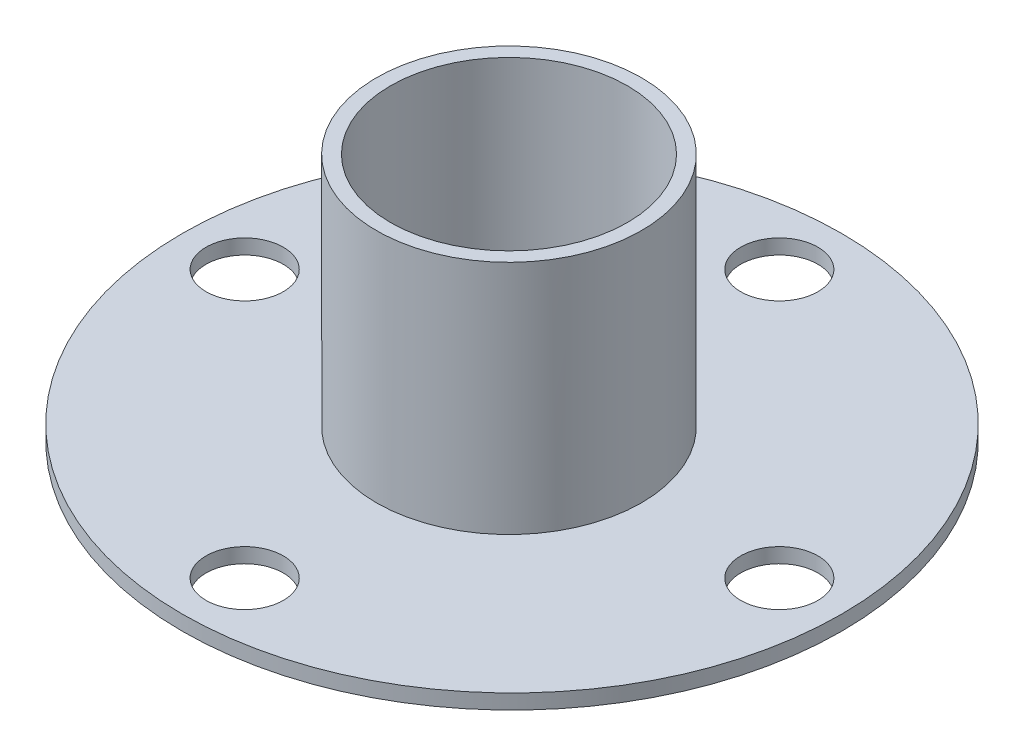
ISO-10303-21;
HEADER;
FILE_DESCRIPTION(('STEP AP214'),'2;1');
FILE_NAME('part.step','',(''),(''),'','','');
FILE_SCHEMA(('AUTOMOTIVE_DESIGN { 1 0 10303 214 1 1 1 1 }'));
ENDSEC;
DATA;
#1=APPLICATION_CONTEXT('core data for automotive mechanical design processes');
#2=APPLICATION_PROTOCOL_DEFINITION('international standard','automotive_design',2000,#1);
#3=PRODUCT_CONTEXT('',#1,'mechanical');
#4=PRODUCT('Part','Part','',(#3));
#5=PRODUCT_RELATED_PRODUCT_CATEGORY('part','',(#4));
#6=PRODUCT_DEFINITION_FORMATION('','',#4);
#7=PRODUCT_DEFINITION_CONTEXT('part definition',#1,'design');
#8=PRODUCT_DEFINITION('design','',#6,#7);
#9=PRODUCT_DEFINITION_SHAPE('','',#8);
#10=(LENGTH_UNIT() NAMED_UNIT(*) SI_UNIT(.MILLI.,.METRE.));
#11=(NAMED_UNIT(*) PLANE_ANGLE_UNIT() SI_UNIT($,.RADIAN.));
#12=(NAMED_UNIT(*) SI_UNIT($,.STERADIAN.) SOLID_ANGLE_UNIT());
#13=UNCERTAINTY_MEASURE_WITH_UNIT(LENGTH_MEASURE(1.E-05),#10,'distance_accuracy_value','');
#14=(GEOMETRIC_REPRESENTATION_CONTEXT(3) GLOBAL_UNCERTAINTY_ASSIGNED_CONTEXT((#13)) GLOBAL_UNIT_ASSIGNED_CONTEXT((#10,
#11,#12)) REPRESENTATION_CONTEXT('',''));
#15=CARTESIAN_POINT('',(0.,0.,0.));
#16=DIRECTION('',(0.,0.,1.));
#17=DIRECTION('',(1.,0.,0.));
#18=AXIS2_PLACEMENT_3D('',#15,#16,#17);
#19=CARTESIAN_POINT('',(9.47475886610459,44.,4.58072204495095));
#20=DIRECTION('',(0.,1.,0.));
#21=DIRECTION('',(0.,0.,1.));
#22=AXIS2_PLACEMENT_3D('',#19,#20,#21);
#23=PLANE('',#22);
#24=CARTESIAN_POINT('',(9.52453165487508,44.,4.83420849198722));
#25=DIRECTION('',(0.,1.,0.));
#26=DIRECTION('',(0.,0.,1.));
#27=AXIS2_PLACEMENT_3D('',#24,#25,#26);
#28=CIRCLE('',#27,6.91436631463015);
#29=CARTESIAN_POINT('',(9.52453165487508,44.,11.7485748066174));
#30=VERTEX_POINT('',#29);
#31=EDGE_CURVE('E67',#30,#30,#28,.T.);
#32=ORIENTED_EDGE('',*,*,#31,.T.);
#33=EDGE_LOOP('',(#32));
#34=FACE_BOUND('',#33,.T.);
#35=CARTESIAN_POINT('',(9.47475886610458,44.,-13.419277955049));
#36=DIRECTION('',(0.,1.,0.));
#37=DIRECTION('',(0.,0.,1.));
#38=AXIS2_PLACEMENT_3D('',#35,#36,#37);
#39=CIRCLE('',#38,2.6);
#40=CARTESIAN_POINT('',(9.47475886610458,44.,-10.819277955049));
#41=VERTEX_POINT('',#40);
#42=EDGE_CURVE('E60',#41,#41,#39,.T.);
#43=ORIENTED_EDGE('',*,*,#42,.T.);
#44=EDGE_LOOP('',(#43));
#45=FACE_BOUND('',#44,.T.);
#46=CARTESIAN_POINT('',(27.4747588661046,44.,4.58072204495095));
#47=DIRECTION('',(0.,1.,0.));
#48=DIRECTION('',(0.,0.,1.));
#49=AXIS2_PLACEMENT_3D('',#46,#47,#48);
#50=CIRCLE('',#49,2.6);
#51=CARTESIAN_POINT('',(27.4747588661046,44.,7.18072204495095));
#52=VERTEX_POINT('',#51);
#53=EDGE_CURVE('E79',#52,#52,#50,.T.);
#54=ORIENTED_EDGE('',*,*,#53,.T.);
#55=EDGE_LOOP('',(#54));
#56=FACE_BOUND('',#55,.T.);
#57=CARTESIAN_POINT('',(9.47475886610459,44.,22.5807220449509));
#58=DIRECTION('',(0.,1.,0.));
#59=DIRECTION('',(0.,0.,1.));
#60=AXIS2_PLACEMENT_3D('',#57,#58,#59);
#61=CIRCLE('',#60,2.6);
#62=CARTESIAN_POINT('',(9.47475886610459,44.,25.180722044951));
#63=VERTEX_POINT('',#62);
#64=EDGE_CURVE('E71',#63,#63,#61,.T.);
#65=ORIENTED_EDGE('',*,*,#64,.T.);
#66=EDGE_LOOP('',(#65));
#67=FACE_BOUND('',#66,.T.);
#68=CARTESIAN_POINT('',(-8.52524113389541,44.,4.58072204495095));
#69=DIRECTION('',(0.,1.,0.));
#70=DIRECTION('',(0.,0.,1.));
#71=AXIS2_PLACEMENT_3D('',#68,#69,#70);
#72=CIRCLE('',#71,2.6);
#73=CARTESIAN_POINT('',(-8.52524113389541,44.,7.18072204495096));
#74=VERTEX_POINT('',#73);
#75=EDGE_CURVE('E62',#74,#74,#72,.T.);
#76=ORIENTED_EDGE('',*,*,#75,.T.);
#77=EDGE_LOOP('',(#76));
#78=FACE_BOUND('',#77,.T.);
#79=CARTESIAN_POINT('',(9.47475886610459,44.,4.58072204495095));
#80=DIRECTION('',(0.,1.,0.));
#81=DIRECTION('',(0.,0.,1.));
#82=AXIS2_PLACEMENT_3D('',#79,#80,#81);
#83=CIRCLE('',#82,22.2);
#84=CARTESIAN_POINT('',(9.47475886610459,44.,26.780722044951));
#85=VERTEX_POINT('',#84);
#86=EDGE_CURVE('E11',#85,#85,#83,.T.);
#87=ORIENTED_EDGE('',*,*,#86,.F.);
#88=EDGE_LOOP('',(#87));
#89=FACE_BOUND('',#88,.T.);
#90=ADVANCED_FACE('F45',(#34,#45,#56,#67,#78,#89),#23,.F.);
#91=CARTESIAN_POINT('',(9.47475886610459,45.,4.58072204495095));
#92=DIRECTION('',(0.,1.,0.));
#93=DIRECTION('',(0.,0.,1.));
#94=AXIS2_PLACEMENT_3D('',#91,#92,#93);
#95=PLANE('',#94);
#96=CARTESIAN_POINT('',(9.52453165487508,45.,4.83420849198722));
#97=DIRECTION('',(0.,1.,0.));
#98=DIRECTION('',(0.,0.,1.));
#99=AXIS2_PLACEMENT_3D('',#96,#97,#98);
#100=CIRCLE('',#99,8.92257088604587);
#101=CARTESIAN_POINT('',(9.52453165487508,45.,13.7567793780331));
#102=VERTEX_POINT('',#101);
#103=EDGE_CURVE('E97',#102,#102,#100,.T.);
#104=ORIENTED_EDGE('',*,*,#103,.F.);
#105=EDGE_LOOP('',(#104));
#106=FACE_BOUND('',#105,.T.);
#107=CARTESIAN_POINT('',(9.47475886610458,45.,-13.419277955049));
#108=DIRECTION('',(0.,1.,0.));
#109=DIRECTION('',(0.,0.,1.));
#110=AXIS2_PLACEMENT_3D('',#107,#108,#109);
#111=CIRCLE('',#110,2.6);
#112=CARTESIAN_POINT('',(9.47475886610458,45.,-10.819277955049));
#113=VERTEX_POINT('',#112);
#114=EDGE_CURVE('E87',#113,#113,#111,.T.);
#115=ORIENTED_EDGE('',*,*,#114,.F.);
#116=EDGE_LOOP('',(#115));
#117=FACE_BOUND('',#116,.T.);
#118=CARTESIAN_POINT('',(27.4747588661046,45.,4.58072204495095));
#119=DIRECTION('',(0.,1.,0.));
#120=DIRECTION('',(0.,0.,1.));
#121=AXIS2_PLACEMENT_3D('',#118,#119,#120);
#122=CIRCLE('',#121,2.6);
#123=CARTESIAN_POINT('',(27.4747588661046,45.,7.18072204495095));
#124=VERTEX_POINT('',#123);
#125=EDGE_CURVE('E83',#124,#124,#122,.T.);
#126=ORIENTED_EDGE('',*,*,#125,.F.);
#127=EDGE_LOOP('',(#126));
#128=FACE_BOUND('',#127,.T.);
#129=CARTESIAN_POINT('',(9.47475886610459,45.,22.5807220449509));
#130=DIRECTION('',(0.,1.,0.));
#131=DIRECTION('',(0.,0.,1.));
#132=AXIS2_PLACEMENT_3D('',#129,#130,#131);
#133=CIRCLE('',#132,2.6);
#134=CARTESIAN_POINT('',(9.47475886610459,45.,25.180722044951));
#135=VERTEX_POINT('',#134);
#136=EDGE_CURVE('E75',#135,#135,#133,.T.);
#137=ORIENTED_EDGE('',*,*,#136,.F.);
#138=EDGE_LOOP('',(#137));
#139=FACE_BOUND('',#138,.T.);
#140=CARTESIAN_POINT('',(-8.52524113389541,45.,4.58072204495095));
#141=DIRECTION('',(0.,1.,0.));
#142=DIRECTION('',(0.,0.,1.));
#143=AXIS2_PLACEMENT_3D('',#140,#141,#142);
#144=CIRCLE('',#143,2.6);
#145=CARTESIAN_POINT('',(-8.52524113389541,45.,7.18072204495096));
#146=VERTEX_POINT('',#145);
#147=EDGE_CURVE('E66',#146,#146,#144,.T.);
#148=ORIENTED_EDGE('',*,*,#147,.F.);
#149=EDGE_LOOP('',(#148));
#150=FACE_BOUND('',#149,.T.);
#151=CARTESIAN_POINT('',(9.47475886610459,45.,4.58072204495095));
#152=DIRECTION('',(0.,1.,0.));
#153=DIRECTION('',(0.,0.,1.));
#154=AXIS2_PLACEMENT_3D('',#151,#152,#153);
#155=CIRCLE('',#154,22.2);
#156=CARTESIAN_POINT('',(9.47475886610459,45.,26.780722044951));
#157=VERTEX_POINT('',#156);
#158=EDGE_CURVE('E54',#157,#157,#155,.T.);
#159=ORIENTED_EDGE('',*,*,#158,.T.);
#160=EDGE_LOOP('',(#159));
#161=FACE_BOUND('',#160,.T.);
#162=ADVANCED_FACE('F133',(#106,#117,#128,#139,#150,#161),#95,.T.);
#163=CARTESIAN_POINT('',(9.47475886610459,44.,4.58072204495095));
#164=DIRECTION('',(0.,1.,0.));
#165=DIRECTION('',(0.,0.,1.));
#166=AXIS2_PLACEMENT_3D('',#163,#164,#165);
#167=CYLINDRICAL_SURFACE('',#166,22.2);
#168=ORIENTED_EDGE('',*,*,#86,.T.);
#169=EDGE_LOOP('',(#168));
#170=FACE_BOUND('',#169,.T.);
#171=ORIENTED_EDGE('',*,*,#158,.F.);
#172=EDGE_LOOP('',(#171));
#173=FACE_BOUND('',#172,.T.);
#174=ADVANCED_FACE('F47',(#170,#173),#167,.T.);
#175=CARTESIAN_POINT('',(-8.52524113389541,44.,4.58072204495095));
#176=DIRECTION('',(0.,1.,0.));
#177=DIRECTION('',(0.,0.,1.));
#178=AXIS2_PLACEMENT_3D('',#175,#176,#177);
#179=CYLINDRICAL_SURFACE('',#178,2.6);
#180=ORIENTED_EDGE('',*,*,#75,.F.);
#181=EDGE_LOOP('',(#180));
#182=FACE_BOUND('',#181,.T.);
#183=ORIENTED_EDGE('',*,*,#147,.T.);
#184=EDGE_LOOP('',(#183));
#185=FACE_BOUND('',#184,.T.);
#186=ADVANCED_FACE('F144',(#182,#185),#179,.F.);
#187=CARTESIAN_POINT('',(9.47475886610459,44.,22.5807220449509));
#188=DIRECTION('',(0.,1.,0.));
#189=DIRECTION('',(0.,0.,1.));
#190=AXIS2_PLACEMENT_3D('',#187,#188,#189);
#191=CYLINDRICAL_SURFACE('',#190,2.6);
#192=ORIENTED_EDGE('',*,*,#64,.F.);
#193=EDGE_LOOP('',(#192));
#194=FACE_BOUND('',#193,.T.);
#195=ORIENTED_EDGE('',*,*,#136,.T.);
#196=EDGE_LOOP('',(#195));
#197=FACE_BOUND('',#196,.T.);
#198=ADVANCED_FACE('F146',(#194,#197),#191,.F.);
#199=CARTESIAN_POINT('',(27.4747588661046,44.,4.58072204495095));
#200=DIRECTION('',(0.,1.,0.));
#201=DIRECTION('',(0.,0.,1.));
#202=AXIS2_PLACEMENT_3D('',#199,#200,#201);
#203=CYLINDRICAL_SURFACE('',#202,2.6);
#204=ORIENTED_EDGE('',*,*,#53,.F.);
#205=EDGE_LOOP('',(#204));
#206=FACE_BOUND('',#205,.T.);
#207=ORIENTED_EDGE('',*,*,#125,.T.);
#208=EDGE_LOOP('',(#207));
#209=FACE_BOUND('',#208,.T.);
#210=ADVANCED_FACE('F149',(#206,#209),#203,.F.);
#211=CARTESIAN_POINT('',(9.47475886610458,44.,-13.419277955049));
#212=DIRECTION('',(0.,1.,0.));
#213=DIRECTION('',(0.,0.,1.));
#214=AXIS2_PLACEMENT_3D('',#211,#212,#213);
#215=CYLINDRICAL_SURFACE('',#214,2.6);
#216=ORIENTED_EDGE('',*,*,#42,.F.);
#217=EDGE_LOOP('',(#216));
#218=FACE_BOUND('',#217,.T.);
#219=ORIENTED_EDGE('',*,*,#114,.T.);
#220=EDGE_LOOP('',(#219));
#221=FACE_BOUND('',#220,.T.);
#222=ADVANCED_FACE('F153',(#218,#221),#215,.F.);
#223=CARTESIAN_POINT('',(9.52453165487508,-4.99999821186066,4.83420849198722));
#224=DIRECTION('',(0.,1.,0.));
#225=DIRECTION('',(0.,0.,1.));
#226=AXIS2_PLACEMENT_3D('',#223,#224,#225);
#227=CYLINDRICAL_SURFACE('',#226,6.91436631463015);
#228=CARTESIAN_POINT('',(9.52453165487508,45.,4.83420849198722));
#229=DIRECTION('',(0.,1.,0.));
#230=DIRECTION('',(0.,0.,1.));
#231=AXIS2_PLACEMENT_3D('',#228,#229,#230);
#232=CIRCLE('',#231,6.91436631463015);
#233=CARTESIAN_POINT('',(9.52453165487508,45.,11.7485748066174));
#234=VERTEX_POINT('',#233);
#235=EDGE_CURVE('E98',#234,#234,#232,.F.);
#236=ORIENTED_EDGE('',*,*,#235,.F.);
#237=EDGE_LOOP('',(#236));
#238=FACE_BOUND('',#237,.T.);
#239=ORIENTED_EDGE('',*,*,#31,.F.);
#240=EDGE_LOOP('',(#239));
#241=FACE_BOUND('',#240,.T.);
#242=ADVANCED_FACE('F157',(#238,#241),#227,.F.);
#243=CARTESIAN_POINT('',(9.52453165487508,65.,4.83420849198722));
#244=DIRECTION('',(0.,-1.,0.));
#245=DIRECTION('',(0.,0.,-1.));
#246=AXIS2_PLACEMENT_3D('',#243,#244,#245);
#247=CYLINDRICAL_SURFACE('',#246,8.92257088604587);
#248=CARTESIAN_POINT('',(9.52453165487508,60.8737149049284,4.83420849198722));
#249=DIRECTION('',(0.,-1.,0.));
#250=DIRECTION('',(0.,0.,-1.));
#251=AXIS2_PLACEMENT_3D('',#248,#249,#250);
#252=CIRCLE('',#251,8.92257088604587);
#253=CARTESIAN_POINT('',(9.52453165487508,60.8737149049284,-4.08836239405865));
#254=VERTEX_POINT('',#253);
#255=EDGE_CURVE('E109',#254,#254,#252,.T.);
#256=ORIENTED_EDGE('',*,*,#255,.T.);
#257=EDGE_LOOP('',(#256));
#258=FACE_BOUND('',#257,.T.);
#259=ORIENTED_EDGE('',*,*,#103,.T.);
#260=EDGE_LOOP('',(#259));
#261=FACE_BOUND('',#260,.T.);
#262=ADVANCED_FACE('F161',(#258,#261),#247,.T.);
#263=CARTESIAN_POINT('',(9.52453165487508,45.,4.83420849198722));
#264=DIRECTION('',(0.,1.,0.));
#265=DIRECTION('',(0.,0.,1.));
#266=AXIS2_PLACEMENT_3D('',#263,#264,#265);
#267=PLANE('',#266);
#268=CARTESIAN_POINT('',(9.52453165487508,45.,4.83420849198722));
#269=DIRECTION('',(0.,1.,0.));
#270=DIRECTION('',(0.,0.,1.));
#271=AXIS2_PLACEMENT_3D('',#268,#269,#270);
#272=CIRCLE('',#271,7.97880080659274);
#273=CARTESIAN_POINT('',(9.52453165487508,45.,12.81300929858));
#274=VERTEX_POINT('',#273);
#275=EDGE_CURVE('E102',#274,#274,#272,.T.);
#276=ORIENTED_EDGE('',*,*,#275,.T.);
#277=EDGE_LOOP('',(#276));
#278=FACE_BOUND('',#277,.T.);
#279=ORIENTED_EDGE('',*,*,#235,.T.);
#280=EDGE_LOOP('',(#279));
#281=FACE_BOUND('',#280,.T.);
#282=ADVANCED_FACE('F129',(#278,#281),#267,.T.);
#283=CARTESIAN_POINT('',(9.52453165487508,45.,4.83420849198722));
#284=DIRECTION('',(0.,1.,0.));
#285=DIRECTION('',(0.,0.,1.));
#286=AXIS2_PLACEMENT_3D('',#283,#284,#285);
#287=CYLINDRICAL_SURFACE('',#286,7.97880080659274);
#288=CARTESIAN_POINT('',(9.52453165487508,60.8737149049284,4.83420849198722));
#289=DIRECTION('',(0.,-1.,0.));
#290=DIRECTION('',(0.,0.,-1.));
#291=AXIS2_PLACEMENT_3D('',#288,#289,#290);
#292=CIRCLE('',#291,7.97880080659274);
#293=CARTESIAN_POINT('',(9.52453165487508,60.8737149049284,-3.14459231460552));
#294=VERTEX_POINT('',#293);
#295=EDGE_CURVE('E49',#294,#294,#292,.F.);
#296=ORIENTED_EDGE('',*,*,#295,.T.);
#297=EDGE_LOOP('',(#296));
#298=FACE_BOUND('',#297,.T.);
#299=ORIENTED_EDGE('',*,*,#275,.F.);
#300=EDGE_LOOP('',(#299));
#301=FACE_BOUND('',#300,.T.);
#302=ADVANCED_FACE('F118',(#298,#301),#287,.F.);
#303=CARTESIAN_POINT('',(9.52453165487508,60.8737149049284,4.83420849198722));
#304=DIRECTION('',(0.,-1.,0.));
#305=DIRECTION('',(0.,0.,-1.));
#306=AXIS2_PLACEMENT_3D('',#303,#304,#305);
#307=PLANE('',#306);
#308=ORIENTED_EDGE('',*,*,#295,.F.);
#309=EDGE_LOOP('',(#308));
#310=FACE_BOUND('',#309,.T.);
#311=ORIENTED_EDGE('',*,*,#255,.F.);
#312=EDGE_LOOP('',(#311));
#313=FACE_BOUND('',#312,.T.);
#314=ADVANCED_FACE('F121',(#310,#313),#307,.F.);
#315=CLOSED_SHELL('',(#90,#162,#174,#186,#198,#210,#222,#242,#262,#282,#302,#314));
#316=MANIFOLD_SOLID_BREP('B2',#315);
#317=ADVANCED_BREP_SHAPE_REPRESENTATION('',(#18,#316),#14);
#318=SHAPE_DEFINITION_REPRESENTATION(#9,#317);
ENDSEC;
END-ISO-10303-21;
